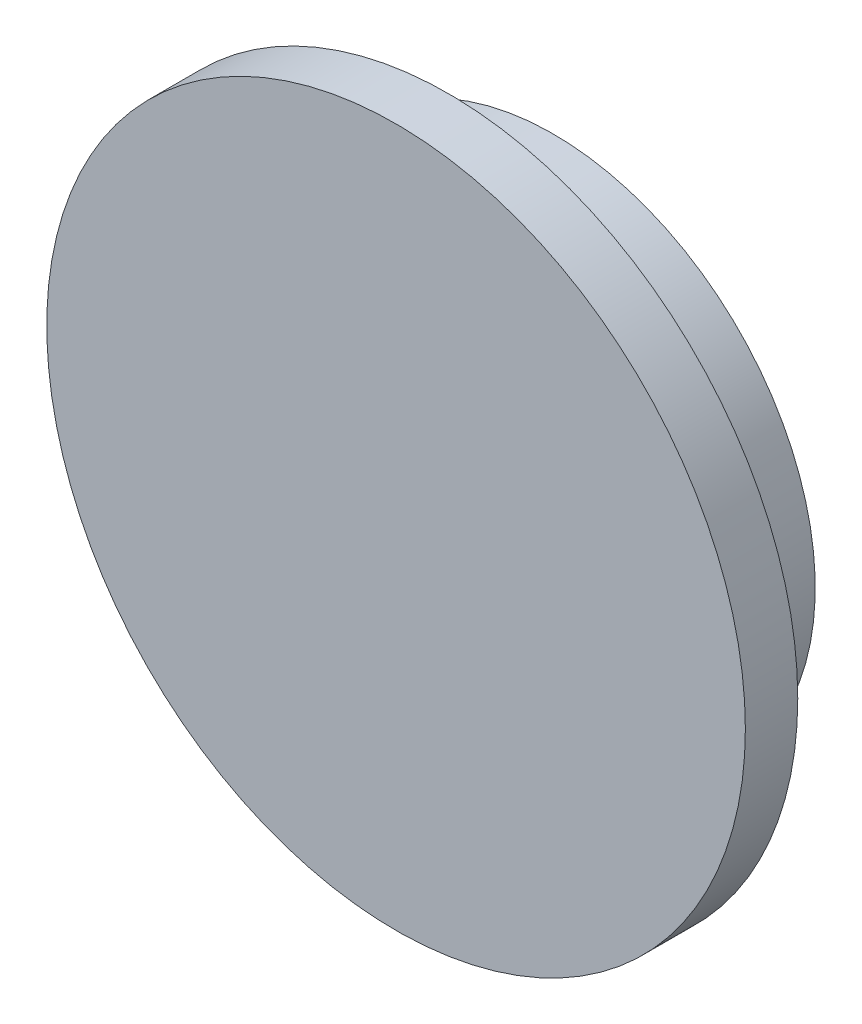
ISO-10303-21;
HEADER;
FILE_DESCRIPTION(('STEP AP214'),'2;1');
FILE_NAME('part.step','',(''),(''),'','','');
FILE_SCHEMA(('AUTOMOTIVE_DESIGN { 1 0 10303 214 1 1 1 1 }'));
ENDSEC;
DATA;
#1=APPLICATION_CONTEXT('core data for automotive mechanical design processes');
#2=APPLICATION_PROTOCOL_DEFINITION('international standard','automotive_design',2000,#1);
#3=PRODUCT_CONTEXT('',#1,'mechanical');
#4=PRODUCT('Part','Part','',(#3));
#5=PRODUCT_RELATED_PRODUCT_CATEGORY('part','',(#4));
#6=PRODUCT_DEFINITION_FORMATION('','',#4);
#7=PRODUCT_DEFINITION_CONTEXT('part definition',#1,'design');
#8=PRODUCT_DEFINITION('design','',#6,#7);
#9=PRODUCT_DEFINITION_SHAPE('','',#8);
#10=(LENGTH_UNIT() NAMED_UNIT(*) SI_UNIT(.MILLI.,.METRE.));
#11=(NAMED_UNIT(*) PLANE_ANGLE_UNIT() SI_UNIT($,.RADIAN.));
#12=(NAMED_UNIT(*) SI_UNIT($,.STERADIAN.) SOLID_ANGLE_UNIT());
#13=UNCERTAINTY_MEASURE_WITH_UNIT(LENGTH_MEASURE(1.E-05),#10,'distance_accuracy_value','');
#14=(GEOMETRIC_REPRESENTATION_CONTEXT(3) GLOBAL_UNCERTAINTY_ASSIGNED_CONTEXT((#13)) GLOBAL_UNIT_ASSIGNED_CONTEXT((#10,
#11,#12)) REPRESENTATION_CONTEXT('',''));
#15=CARTESIAN_POINT('',(0.,0.,0.));
#16=DIRECTION('',(0.,0.,1.));
#17=DIRECTION('',(1.,0.,0.));
#18=AXIS2_PLACEMENT_3D('',#15,#16,#17);
#19=CARTESIAN_POINT('',(0.,0.,30.));
#20=DIRECTION('',(0.,0.,-1.));
#21=DIRECTION('',(-1.,0.,0.));
#22=AXIS2_PLACEMENT_3D('',#19,#20,#21);
#23=CYLINDRICAL_SURFACE('',#22,200.);
#24=CARTESIAN_POINT('',(0.,0.,30.));
#25=DIRECTION('',(0.,0.,1.));
#26=DIRECTION('',(1.,0.,0.));
#27=AXIS2_PLACEMENT_3D('',#24,#25,#26);
#28=CIRCLE('',#27,200.);
#29=CARTESIAN_POINT('',(200.,0.,30.));
#30=VERTEX_POINT('',#29);
#31=EDGE_CURVE('E44',#30,#30,#28,.T.);
#32=ORIENTED_EDGE('',*,*,#31,.F.);
#33=EDGE_LOOP('',(#32));
#34=FACE_BOUND('',#33,.T.);
#35=CARTESIAN_POINT('',(0.,0.,0.));
#36=DIRECTION('',(0.,0.,1.));
#37=DIRECTION('',(1.,0.,0.));
#38=AXIS2_PLACEMENT_3D('',#35,#36,#37);
#39=CIRCLE('',#38,200.);
#40=CARTESIAN_POINT('',(200.,0.,0.));
#41=VERTEX_POINT('',#40);
#42=EDGE_CURVE('E40',#41,#41,#39,.T.);
#43=ORIENTED_EDGE('',*,*,#42,.T.);
#44=EDGE_LOOP('',(#43));
#45=FACE_BOUND('',#44,.T.);
#46=ADVANCED_FACE('F37',(#34,#45),#23,.T.);
#47=CARTESIAN_POINT('',(0.,0.,30.));
#48=DIRECTION('',(0.,0.,1.));
#49=DIRECTION('',(1.,0.,0.));
#50=AXIS2_PLACEMENT_3D('',#47,#48,#49);
#51=PLANE('',#50);
#52=ORIENTED_EDGE('',*,*,#31,.T.);
#53=EDGE_LOOP('',(#52));
#54=FACE_BOUND('',#53,.T.);
#55=ADVANCED_FACE('F81',(#54),#51,.T.);
#56=CARTESIAN_POINT('',(0.,0.,0.));
#57=DIRECTION('',(0.,0.,1.));
#58=DIRECTION('',(1.,0.,0.));
#59=AXIS2_PLACEMENT_3D('',#56,#57,#58);
#60=PLANE('',#59);
#61=CARTESIAN_POINT('',(0.,0.,0.));
#62=DIRECTION('',(0.,0.,-1.));
#63=DIRECTION('',(-1.,0.,0.));
#64=AXIS2_PLACEMENT_3D('',#61,#62,#63);
#65=CIRCLE('',#64,150.);
#66=CARTESIAN_POINT('',(-150.,0.,0.));
#67=VERTEX_POINT('',#66);
#68=EDGE_CURVE('E10',#67,#67,#65,.T.);
#69=ORIENTED_EDGE('',*,*,#68,.F.);
#70=EDGE_LOOP('',(#69));
#71=FACE_BOUND('',#70,.T.);
#72=ORIENTED_EDGE('',*,*,#42,.F.);
#73=EDGE_LOOP('',(#72));
#74=FACE_BOUND('',#73,.T.);
#75=ADVANCED_FACE('F76',(#71,#74),#60,.F.);
#76=CARTESIAN_POINT('',(0.,0.,-60.));
#77=DIRECTION('',(0.,0.,1.));
#78=DIRECTION('',(1.,0.,0.));
#79=AXIS2_PLACEMENT_3D('',#76,#77,#78);
#80=CYLINDRICAL_SURFACE('',#79,150.);
#81=CARTESIAN_POINT('',(0.,0.,-60.));
#82=DIRECTION('',(0.,0.,-1.));
#83=DIRECTION('',(-1.,0.,0.));
#84=AXIS2_PLACEMENT_3D('',#81,#82,#83);
#85=CIRCLE('',#84,150.);
#86=CARTESIAN_POINT('',(-150.,0.,-60.));
#87=VERTEX_POINT('',#86);
#88=EDGE_CURVE('E50',#87,#87,#85,.T.);
#89=ORIENTED_EDGE('',*,*,#88,.F.);
#90=EDGE_LOOP('',(#89));
#91=FACE_BOUND('',#90,.T.);
#92=ORIENTED_EDGE('',*,*,#68,.T.);
#93=EDGE_LOOP('',(#92));
#94=FACE_BOUND('',#93,.T.);
#95=ADVANCED_FACE('F71',(#91,#94),#80,.T.);
#96=CARTESIAN_POINT('',(0.,0.,-60.));
#97=DIRECTION('',(0.,0.,-1.));
#98=DIRECTION('',(-1.,0.,0.));
#99=AXIS2_PLACEMENT_3D('',#96,#97,#98);
#100=PLANE('',#99);
#101=CARTESIAN_POINT('',(0.,0.,-60.));
#102=DIRECTION('',(0.,0.,-1.));
#103=DIRECTION('',(-1.,0.,0.));
#104=AXIS2_PLACEMENT_3D('',#101,#102,#103);
#105=CIRCLE('',#104,48.);
#106=CARTESIAN_POINT('',(-48.,0.,-60.));
#107=VERTEX_POINT('',#106);
#108=EDGE_CURVE('E54',#107,#107,#105,.T.);
#109=ORIENTED_EDGE('',*,*,#108,.F.);
#110=EDGE_LOOP('',(#109));
#111=FACE_BOUND('',#110,.T.);
#112=ORIENTED_EDGE('',*,*,#88,.T.);
#113=EDGE_LOOP('',(#112));
#114=FACE_BOUND('',#113,.T.);
#115=ADVANCED_FACE('F65',(#111,#114),#100,.T.);
#116=CARTESIAN_POINT('',(0.,0.,-15.));
#117=DIRECTION('',(0.,0.,-1.));
#118=DIRECTION('',(-1.,0.,0.));
#119=AXIS2_PLACEMENT_3D('',#116,#117,#118);
#120=CYLINDRICAL_SURFACE('',#119,48.);
#121=CARTESIAN_POINT('',(0.,0.,-15.));
#122=DIRECTION('',(0.,0.,-1.));
#123=DIRECTION('',(-1.,0.,0.));
#124=AXIS2_PLACEMENT_3D('',#121,#122,#123);
#125=CIRCLE('',#124,48.);
#126=CARTESIAN_POINT('',(-48.,0.,-15.));
#127=VERTEX_POINT('',#126);
#128=EDGE_CURVE('E53',#127,#127,#125,.T.);
#129=CARTESIAN_POINT('',(-48.,0.,-15.));
#130=CARTESIAN_POINT('',(-48.,0.,-15.46875));
#131=CARTESIAN_POINT('',(-48.,0.,-15.9375));
#132=CARTESIAN_POINT('',(-48.,0.,-16.875));
#133=CARTESIAN_POINT('',(-48.,0.,-17.34375));
#134=CARTESIAN_POINT('',(-48.,0.,-18.28125));
#135=CARTESIAN_POINT('',(-48.,0.,-18.75));
#136=CARTESIAN_POINT('',(-48.,0.,-19.6875));
#137=CARTESIAN_POINT('',(-48.,0.,-20.15625));
#138=CARTESIAN_POINT('',(-48.,0.,-21.09375));
#139=CARTESIAN_POINT('',(-48.,0.,-21.5625));
#140=CARTESIAN_POINT('',(-48.,0.,-22.5));
#141=CARTESIAN_POINT('',(-48.,0.,-22.96875));
#142=CARTESIAN_POINT('',(-48.,0.,-23.90625));
#143=CARTESIAN_POINT('',(-48.,0.,-24.375));
#144=CARTESIAN_POINT('',(-48.,0.,-25.3125));
#145=CARTESIAN_POINT('',(-48.,0.,-25.78125));
#146=CARTESIAN_POINT('',(-48.,0.,-26.71875));
#147=CARTESIAN_POINT('',(-48.,0.,-27.1875));
#148=CARTESIAN_POINT('',(-48.,0.,-28.125));
#149=CARTESIAN_POINT('',(-48.,0.,-28.59375));
#150=CARTESIAN_POINT('',(-48.,0.,-29.53125));
#151=CARTESIAN_POINT('',(-48.,0.,-30.));
#152=CARTESIAN_POINT('',(-48.,0.,-30.9375));
#153=CARTESIAN_POINT('',(-48.,0.,-31.40625));
#154=CARTESIAN_POINT('',(-48.,0.,-32.34375));
#155=CARTESIAN_POINT('',(-48.,0.,-32.8125));
#156=CARTESIAN_POINT('',(-48.,0.,-33.75));
#157=CARTESIAN_POINT('',(-48.,0.,-34.21875));
#158=CARTESIAN_POINT('',(-48.,0.,-35.15625));
#159=CARTESIAN_POINT('',(-48.,0.,-35.625));
#160=CARTESIAN_POINT('',(-48.,0.,-36.5625));
#161=CARTESIAN_POINT('',(-48.,0.,-37.03125));
#162=CARTESIAN_POINT('',(-48.,0.,-37.96875));
#163=CARTESIAN_POINT('',(-48.,0.,-38.4375));
#164=CARTESIAN_POINT('',(-48.,0.,-39.375));
#165=CARTESIAN_POINT('',(-48.,0.,-39.84375));
#166=CARTESIAN_POINT('',(-48.,0.,-40.78125));
#167=CARTESIAN_POINT('',(-48.,0.,-41.25));
#168=CARTESIAN_POINT('',(-48.,0.,-42.1875));
#169=CARTESIAN_POINT('',(-48.,0.,-42.65625));
#170=CARTESIAN_POINT('',(-48.,0.,-43.59375));
#171=CARTESIAN_POINT('',(-48.,0.,-44.0625));
#172=CARTESIAN_POINT('',(-48.,0.,-45.));
#173=CARTESIAN_POINT('',(-48.,0.,-45.46875));
#174=CARTESIAN_POINT('',(-48.,0.,-46.40625));
#175=CARTESIAN_POINT('',(-48.,0.,-46.875));
#176=CARTESIAN_POINT('',(-48.,0.,-47.8125));
#177=CARTESIAN_POINT('',(-48.,0.,-48.28125));
#178=CARTESIAN_POINT('',(-48.,0.,-49.21875));
#179=CARTESIAN_POINT('',(-48.,0.,-49.6875));
#180=CARTESIAN_POINT('',(-48.,0.,-50.625));
#181=CARTESIAN_POINT('',(-48.,0.,-51.09375));
#182=CARTESIAN_POINT('',(-48.,0.,-52.03125));
#183=CARTESIAN_POINT('',(-48.,0.,-52.5));
#184=CARTESIAN_POINT('',(-48.,0.,-53.4375));
#185=CARTESIAN_POINT('',(-48.,0.,-53.90625));
#186=CARTESIAN_POINT('',(-48.,0.,-54.84375));
#187=CARTESIAN_POINT('',(-48.,0.,-55.3125));
#188=CARTESIAN_POINT('',(-48.,0.,-56.25));
#189=CARTESIAN_POINT('',(-48.,0.,-56.71875));
#190=CARTESIAN_POINT('',(-48.,0.,-57.65625));
#191=CARTESIAN_POINT('',(-48.,0.,-58.125));
#192=CARTESIAN_POINT('',(-48.,0.,-59.0625));
#193=CARTESIAN_POINT('',(-48.,0.,-59.53125));
#194=CARTESIAN_POINT('',(-48.,0.,-60.));
#195=B_SPLINE_CURVE_WITH_KNOTS('',3,(#129,#130,#131,#132,#133,#134,#135,#136,#137,#138,#139,
#140,#141,#142,#143,#144,#145,#146,#147,#148,#149,#150,#151,#152,#153,#154,#155,#156,#157,#158,
#159,#160,#161,#162,#163,#164,#165,#166,#167,#168,#169,#170,#171,#172,#173,#174,#175,#176,#177,
#178,#179,#180,#181,#182,#183,#184,#185,#186,#187,#188,#189,#190,#191,#192,#193,#194),
.UNSPECIFIED.,.F.,.F.,(4,2,2,2,2,2,2,2,2,2,2,2,2,2,2,2,2,2,2,2,2,2,2,2,2,2,2,2,2,2,2,2,4),(0.,
1.40625,2.8125,4.21875,5.625,7.03125,8.4375,9.84375,11.25,12.65625,14.0625,15.46875,16.875,
18.28125,19.6875,21.09375,22.5,23.90625,25.3125,26.71875,28.125,29.53125,30.9375,32.34375,33.75,
35.15625,36.5625,37.96875,39.375,40.78125,42.1875,43.59375,45.),.UNSPECIFIED.);
#196=EDGE_CURVE('BSEAM62',#127,#107,#195,.T.);
#197=ORIENTED_EDGE('',*,*,#128,.F.);
#198=ORIENTED_EDGE('',*,*,#108,.T.);
#199=ORIENTED_EDGE('',*,*,#196,.T.);
#200=ORIENTED_EDGE('',*,*,#196,.F.);
#201=EDGE_LOOP('',(#197,#199,#198,#200));
#202=FACE_BOUND('',#201,.T.);
#203=ADVANCED_FACE('F62',(#202),#120,.F.);
#204=CARTESIAN_POINT('',(0.,0.,-15.));
#205=DIRECTION('',(0.,0.,-1.));
#206=DIRECTION('',(-1.,0.,0.));
#207=AXIS2_PLACEMENT_3D('',#204,#205,#206);
#208=PLANE('',#207);
#209=ORIENTED_EDGE('',*,*,#128,.T.);
#210=EDGE_LOOP('',(#209));
#211=FACE_BOUND('',#210,.T.);
#212=ADVANCED_FACE('F60',(#211),#208,.T.);
#213=CLOSED_SHELL('',(#46,#55,#75,#95,#115,#203,#212));
#214=MANIFOLD_SOLID_BREP('B2',#213);
#215=ADVANCED_BREP_SHAPE_REPRESENTATION('',(#18,#214),#14);
#216=SHAPE_DEFINITION_REPRESENTATION(#9,#215);
ENDSEC;
END-ISO-10303-21;
